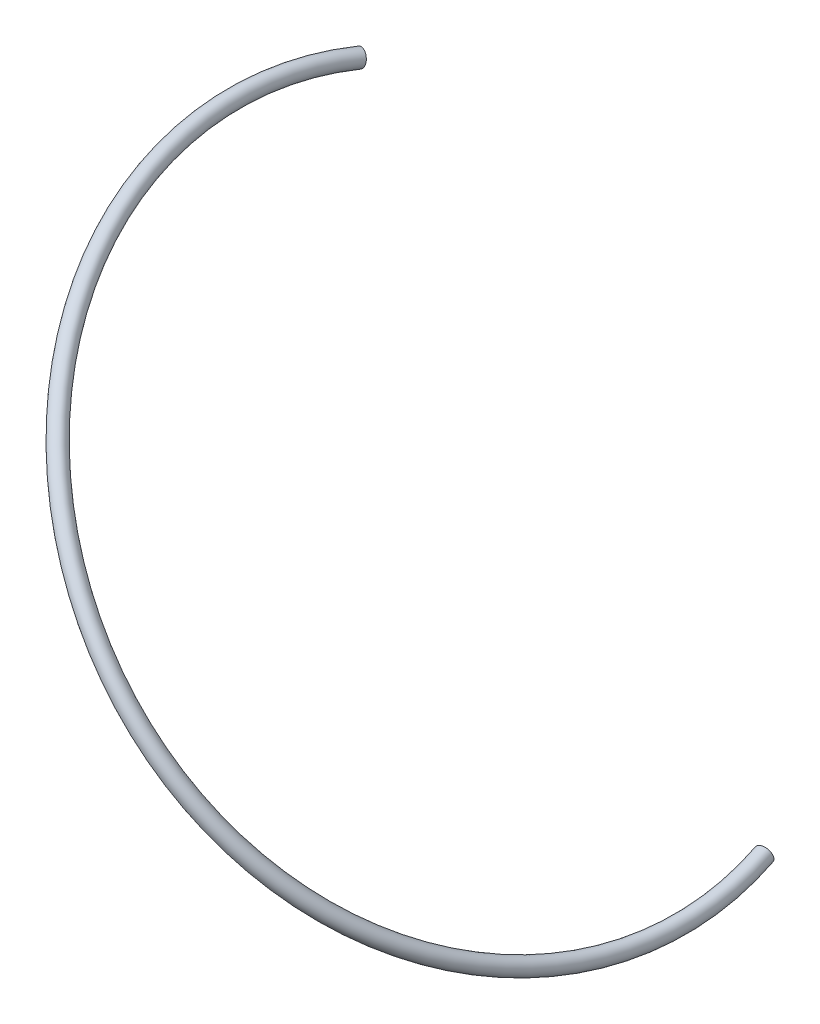
ISO-10303-21;
HEADER;
FILE_DESCRIPTION(('STEP AP214'),'2;1');
FILE_NAME('part.step','',(''),(''),'','','');
FILE_SCHEMA(('AUTOMOTIVE_DESIGN { 1 0 10303 214 1 1 1 1 }'));
ENDSEC;
DATA;
#1=APPLICATION_CONTEXT('core data for automotive mechanical design processes');
#2=APPLICATION_PROTOCOL_DEFINITION('international standard','automotive_design',2000,#1);
#3=PRODUCT_CONTEXT('',#1,'mechanical');
#4=PRODUCT('Part','Part','',(#3));
#5=PRODUCT_RELATED_PRODUCT_CATEGORY('part','',(#4));
#6=PRODUCT_DEFINITION_FORMATION('','',#4);
#7=PRODUCT_DEFINITION_CONTEXT('part definition',#1,'design');
#8=PRODUCT_DEFINITION('design','',#6,#7);
#9=PRODUCT_DEFINITION_SHAPE('','',#8);
#10=(LENGTH_UNIT() NAMED_UNIT(*) SI_UNIT(.MILLI.,.METRE.));
#11=(NAMED_UNIT(*) PLANE_ANGLE_UNIT() SI_UNIT($,.RADIAN.));
#12=(NAMED_UNIT(*) SI_UNIT($,.STERADIAN.) SOLID_ANGLE_UNIT());
#13=UNCERTAINTY_MEASURE_WITH_UNIT(LENGTH_MEASURE(1.E-05),#10,'distance_accuracy_value','');
#14=(GEOMETRIC_REPRESENTATION_CONTEXT(3) GLOBAL_UNCERTAINTY_ASSIGNED_CONTEXT((#13)) GLOBAL_UNIT_ASSIGNED_CONTEXT((#10,
#11,#12)) REPRESENTATION_CONTEXT('',''));
#15=CARTESIAN_POINT('',(0.,0.,0.));
#16=DIRECTION('',(0.,0.,1.));
#17=DIRECTION('',(1.,0.,0.));
#18=AXIS2_PLACEMENT_3D('',#15,#16,#17);
#19=CARTESIAN_POINT('',(137.500000000001,25.8499999999997,22.2500000000002));
#20=DIRECTION('',(-0.226366540965368,0.250044590770945,0.941401026001972));
#21=DIRECTION('',(0.,-0.96648896223998,0.256708172577905));
#22=AXIS2_PLACEMENT_3D('',#19,#20,#21);
#23=PLANE('',#22);
#24=CARTESIAN_POINT('',(137.500000000001,25.8499999999997,22.2500000000002));
#25=DIRECTION('',(-0.226366540965368,0.250044590770945,0.941401026001972));
#26=DIRECTION('',(0.,-0.96648896223998,0.256708172577905));
#27=AXIS2_PLACEMENT_3D('',#24,#25,#26);
#28=CIRCLE('',#27,2.00000000000001);
#29=CARTESIAN_POINT('',(136.236386479655,27.2457881064933,21.5754212922353));
#30=VERTEX_POINT('',#29);
#31=EDGE_CURVE('E55',#30,#30,#28,.T.);
#32=ORIENTED_EDGE('',*,*,#31,.F.);
#33=EDGE_LOOP('',(#32));
#34=FACE_BOUND('',#33,.T.);
#35=ADVANCED_FACE('F49',(#34),#23,.F.);
#36=CARTESIAN_POINT('',(240.75,-88.1999999999985,27.0000000000018));
#37=DIRECTION('',(-0.186957898775316,0.206513785523725,-0.960415951801187));
#38=DIRECTION('',(-0.971438659920254,0.106562651938272,0.21201728991812));
#39=AXIS2_PLACEMENT_3D('',#36,#37,#38);
#40=PLANE('',#39);
#41=CARTESIAN_POINT('',(240.75,-88.1999999999985,27.0000000000018));
#42=DIRECTION('',(-0.186957898775316,0.206513785523725,-0.960415951801187));
#43=DIRECTION('',(-0.971438659920254,0.106562651938272,0.21201728991812));
#44=AXIS2_PLACEMENT_3D('',#41,#42,#43);
#45=CIRCLE('',#44,2.00000000000001);
#46=CARTESIAN_POINT('',(242.039136667936,-89.6239809876802,26.4428601628844));
#47=VERTEX_POINT('',#46);
#48=EDGE_CURVE('E11',#47,#47,#45,.T.);
#49=ORIENTED_EDGE('',*,*,#48,.T.);
#50=EDGE_LOOP('',(#49));
#51=FACE_BOUND('',#50,.T.);
#52=ADVANCED_FACE('F64',(#51),#40,.T.);
#53=CARTESIAN_POINT('',(188.608838058109,-30.6048472690291,49.5343977826087));
#54=DIRECTION('',(0.741335556230142,0.671134556604669,0.));
#55=DIRECTION('',(-0.671134556604669,0.741335556230142,0.));
#56=AXIS2_PLACEMENT_3D('',#53,#54,#55);
#57=TOROIDAL_SURFACE('',#56,80.8931484748796,2.00000000000001);
#58=CARTESIAN_POINT('',(188.608838058109,-30.6048472690291,49.5343977826087));
#59=DIRECTION('',(0.741335556230142,0.671134556604669,0.));
#60=DIRECTION('',(-0.671134556604669,0.741335556230142,0.));
#61=AXIS2_PLACEMENT_3D('',#58,#59,#60);
#62=CIRCLE('',#61,82.8931484748797);
#63=EDGE_CURVE('',#30,#47,#62,.T.);
#64=ORIENTED_EDGE('',*,*,#31,.T.);
#65=ORIENTED_EDGE('',*,*,#48,.F.);
#66=ORIENTED_EDGE('',*,*,#63,.T.);
#67=ORIENTED_EDGE('',*,*,#63,.F.);
#68=EDGE_LOOP('',(#64,#66,#65,#67));
#69=FACE_BOUND('',#68,.T.);
#70=ADVANCED_FACE('F61',(#69),#57,.T.);
#71=CLOSED_SHELL('',(#35,#52,#70));
#72=MANIFOLD_SOLID_BREP('B2',#71);
#73=ADVANCED_BREP_SHAPE_REPRESENTATION('',(#18,#72),#14);
#74=SHAPE_DEFINITION_REPRESENTATION(#9,#73);
ENDSEC;
END-ISO-10303-21;
